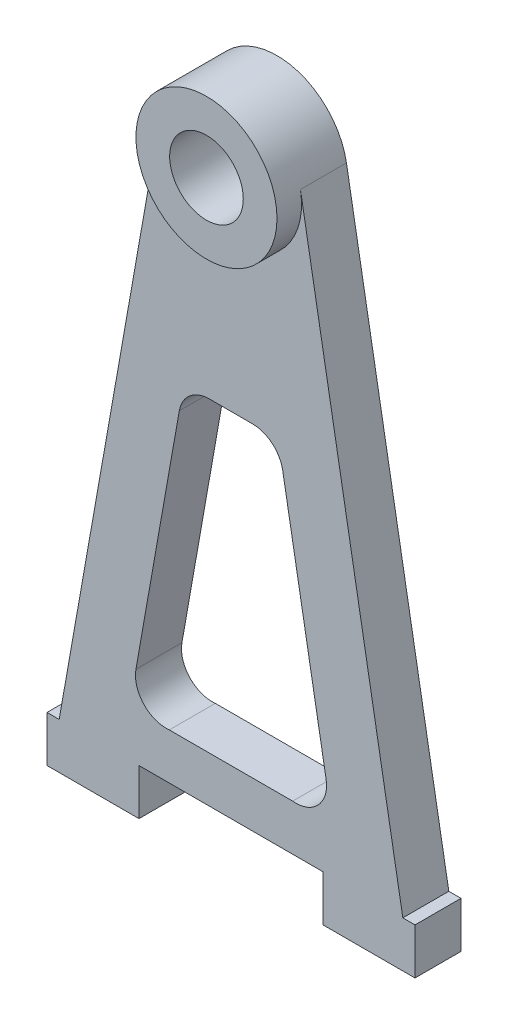
ISO-10303-21;
HEADER;
FILE_DESCRIPTION(('STEP AP214'),'2;1');
FILE_NAME('part.step','',(''),(''),'','','');
FILE_SCHEMA(('AUTOMOTIVE_DESIGN { 1 0 10303 214 1 1 1 1 }'));
ENDSEC;
DATA;
#1=APPLICATION_CONTEXT('core data for automotive mechanical design processes');
#2=APPLICATION_PROTOCOL_DEFINITION('international standard','automotive_design',2000,#1);
#3=PRODUCT_CONTEXT('',#1,'mechanical');
#4=PRODUCT('Part','Part','',(#3));
#5=PRODUCT_RELATED_PRODUCT_CATEGORY('part','',(#4));
#6=PRODUCT_DEFINITION_FORMATION('','',#4);
#7=PRODUCT_DEFINITION_CONTEXT('part definition',#1,'design');
#8=PRODUCT_DEFINITION('design','',#6,#7);
#9=PRODUCT_DEFINITION_SHAPE('','',#8);
#10=(LENGTH_UNIT() NAMED_UNIT(*) SI_UNIT(.MILLI.,.METRE.));
#11=(NAMED_UNIT(*) PLANE_ANGLE_UNIT() SI_UNIT($,.RADIAN.));
#12=(NAMED_UNIT(*) SI_UNIT($,.STERADIAN.) SOLID_ANGLE_UNIT());
#13=UNCERTAINTY_MEASURE_WITH_UNIT(LENGTH_MEASURE(1.E-05),#10,'distance_accuracy_value','');
#14=(GEOMETRIC_REPRESENTATION_CONTEXT(3) GLOBAL_UNCERTAINTY_ASSIGNED_CONTEXT((#13)) GLOBAL_UNIT_ASSIGNED_CONTEXT((#10,
#11,#12)) REPRESENTATION_CONTEXT('',''));
#15=CARTESIAN_POINT('',(0.,0.,0.));
#16=DIRECTION('',(0.,0.,1.));
#17=DIRECTION('',(1.,0.,0.));
#18=AXIS2_PLACEMENT_3D('',#15,#16,#17);
#19=CARTESIAN_POINT('',(3.63595201882336,12.0582597750053,7.5));
#20=DIRECTION('',(0.,0.,1.));
#21=DIRECTION('',(1.,0.,0.));
#22=AXIS2_PLACEMENT_3D('',#19,#20,#21);
#23=PLANE('',#22);
#24=DIRECTION('',(-0.173913043478261,0.984761013296185,0.));
#25=VECTOR('',#24,1.);
#26=CARTESIAN_POINT('',(19.1387779442577,-67.0995669868842,7.5));
#27=LINE('',#26,#25);
#28=CARTESIAN_POINT('',(19.1387779442577,-67.0995669868842,7.5));
#29=VERTEX_POINT('',#28);
#30=CARTESIAN_POINT('',(12.0697678315266,-27.0721750076034,7.5));
#31=VERTEX_POINT('',#30);
#32=EDGE_CURVE('E230',#29,#31,#27,.T.);
#33=ORIENTED_EDGE('',*,*,#32,.F.);
#34=CARTESIAN_POINT('',(14.2149728777768,-67.9691322042755,7.5));
#35=DIRECTION('',(0.,0.,1.));
#36=DIRECTION('',(1.,0.,0.));
#37=AXIS2_PLACEMENT_3D('',#34,#35,#36);
#38=CIRCLE('',#37,5.);
#39=CARTESIAN_POINT('',(13.6923167075471,-72.9417402249947,7.5));
#40=VERTEX_POINT('',#39);
#41=EDGE_CURVE('E227',#40,#29,#38,.T.);
#42=ORIENTED_EDGE('',*,*,#41,.F.);
#43=DIRECTION('',(1.,0.,0.));
#44=VECTOR('',#43,1.);
#45=CARTESIAN_POINT('',(-6.42041266990043,-72.9417402249947,7.5));
#46=LINE('',#45,#44);
#47=CARTESIAN_POINT('',(-6.42041266990043,-72.9417402249947,7.5));
#48=VERTEX_POINT('',#47);
#49=EDGE_CURVE('E249',#48,#40,#46,.T.);
#50=ORIENTED_EDGE('',*,*,#49,.F.);
#51=CARTESIAN_POINT('',(-6.9430688401301,-67.9691322042755,7.5));
#52=DIRECTION('',(0.,0.,1.));
#53=DIRECTION('',(1.,0.,0.));
#54=AXIS2_PLACEMENT_3D('',#51,#52,#53);
#55=CIRCLE('',#54,5.);
#56=CARTESIAN_POINT('',(-11.866873906611,-67.0995669868842,7.5));
#57=VERTEX_POINT('',#56);
#58=EDGE_CURVE('E246',#57,#48,#55,.T.);
#59=ORIENTED_EDGE('',*,*,#58,.F.);
#60=DIRECTION('',(-0.173913043478261,-0.984761013296185,0.));
#61=VECTOR('',#60,1.);
#62=CARTESIAN_POINT('',(-4.79786379387993,-27.0721750076034,7.5));
#63=LINE('',#62,#61);
#64=CARTESIAN_POINT('',(-4.79786379387993,-27.0721750076034,7.5));
#65=VERTEX_POINT('',#64);
#66=EDGE_CURVE('E243',#65,#57,#63,.T.);
#67=ORIENTED_EDGE('',*,*,#66,.F.);
#68=CARTESIAN_POINT('',(0.125941272600995,-27.9417402249947,7.5));
#69=DIRECTION('',(0.,0.,1.));
#70=DIRECTION('',(-1.,0.,0.));
#71=AXIS2_PLACEMENT_3D('',#68,#69,#70);
#72=CIRCLE('',#71,5.);
#73=CARTESIAN_POINT('',(0.125941272600994,-22.9417402249947,7.5));
#74=VERTEX_POINT('',#73);
#75=EDGE_CURVE('E240',#74,#65,#72,.T.);
#76=ORIENTED_EDGE('',*,*,#75,.F.);
#77=DIRECTION('',(-1.,0.,0.));
#78=VECTOR('',#77,1.);
#79=CARTESIAN_POINT('',(7.14596276504572,-22.9417402249947,7.5));
#80=LINE('',#79,#78);
#81=CARTESIAN_POINT('',(7.14596276504572,-22.9417402249947,7.5));
#82=VERTEX_POINT('',#81);
#83=EDGE_CURVE('E237',#82,#74,#80,.T.);
#84=ORIENTED_EDGE('',*,*,#83,.F.);
#85=CARTESIAN_POINT('',(7.14596276504572,-27.9417402249947,7.5));
#86=DIRECTION('',(0.,0.,1.));
#87=DIRECTION('',(1.,0.,0.));
#88=AXIS2_PLACEMENT_3D('',#85,#86,#87);
#89=CIRCLE('',#88,5.);
#90=EDGE_CURVE('E234',#31,#82,#89,.T.);
#91=ORIENTED_EDGE('',*,*,#90,.F.);
#92=EDGE_LOOP('',(#33,#42,#50,#59,#67,#76,#84,#91));
#93=FACE_BOUND('',#92,.T.);
#94=DIRECTION('',(1.,0.,0.));
#95=VECTOR('',#94,1.);
#96=CARTESIAN_POINT('',(-26.3640479811766,-87.9417402249947,7.5));
#97=LINE('',#96,#95);
#98=CARTESIAN_POINT('',(-26.3640479811766,-87.9417402249947,7.5));
#99=VERTEX_POINT('',#98);
#100=CARTESIAN_POINT('',(-11.3640479811766,-87.9417402249947,7.5));
#101=VERTEX_POINT('',#100);
#102=EDGE_CURVE('E200',#99,#101,#97,.T.);
#103=ORIENTED_EDGE('',*,*,#102,.T.);
#104=DIRECTION('',(0.,1.,0.));
#105=VECTOR('',#104,1.);
#106=CARTESIAN_POINT('',(-11.3640479811766,-87.9417402249947,7.5));
#107=LINE('',#106,#105);
#108=CARTESIAN_POINT('',(-11.3640479811766,-80.4417402249947,7.5));
#109=VERTEX_POINT('',#108);
#110=EDGE_CURVE('E180',#101,#109,#107,.T.);
#111=ORIENTED_EDGE('',*,*,#110,.T.);
#112=DIRECTION('',(1.,0.,0.));
#113=VECTOR('',#112,1.);
#114=CARTESIAN_POINT('',(-11.3640479811766,-80.4417402249947,7.5));
#115=LINE('',#114,#113);
#116=CARTESIAN_POINT('',(18.6359520188234,-80.4417402249947,7.5));
#117=VERTEX_POINT('',#116);
#118=EDGE_CURVE('E190',#109,#117,#115,.T.);
#119=ORIENTED_EDGE('',*,*,#118,.T.);
#120=DIRECTION('',(0.,1.,0.));
#121=VECTOR('',#120,1.);
#122=CARTESIAN_POINT('',(18.6359520188234,-87.9417402249947,7.5));
#123=LINE('',#122,#121);
#124=CARTESIAN_POINT('',(18.6359520188234,-87.9417402249947,7.5));
#125=VERTEX_POINT('',#124);
#126=EDGE_CURVE('E196',#125,#117,#123,.T.);
#127=ORIENTED_EDGE('',*,*,#126,.F.);
#128=CARTESIAN_POINT('',(33.6359520188234,-87.9417402249947,7.5));
#129=VERTEX_POINT('',#128);
#130=EDGE_CURVE('E322',#125,#129,#97,.T.);
#131=ORIENTED_EDGE('',*,*,#130,.T.);
#132=DIRECTION('',(0.,1.,0.));
#133=VECTOR('',#132,1.);
#134=CARTESIAN_POINT('',(33.6359520188234,-80.4417402249947,7.5));
#135=LINE('',#134,#133);
#136=CARTESIAN_POINT('',(33.6359520188234,-80.4417402249947,7.5));
#137=VERTEX_POINT('',#136);
#138=EDGE_CURVE('E325',#129,#137,#135,.T.);
#139=ORIENTED_EDGE('',*,*,#138,.T.);
#140=DIRECTION('',(-1.,0.,0.));
#141=VECTOR('',#140,1.);
#142=CARTESIAN_POINT('',(31.649811370749,-80.4417402249947,7.5));
#143=LINE('',#142,#141);
#144=CARTESIAN_POINT('',(31.649811370749,-80.4417402249947,7.5));
#145=VERTEX_POINT('',#144);
#146=EDGE_CURVE('E328',#137,#145,#143,.T.);
#147=ORIENTED_EDGE('',*,*,#146,.T.);
#148=DIRECTION('',(-0.173913043478261,0.984761013296185,0.));
#149=VECTOR('',#148,1.);
#150=CARTESIAN_POINT('',(14.9607036717295,14.0582597750053,7.5));
#151=LINE('',#150,#149);
#152=CARTESIAN_POINT('',(14.9607036717295,14.0582597750053,7.5));
#153=VERTEX_POINT('',#152);
#154=EDGE_CURVE('E331',#145,#153,#151,.T.);
#155=ORIENTED_EDGE('',*,*,#154,.T.);
#156=CARTESIAN_POINT('',(3.63595201882336,12.0582597750053,7.5));
#157=DIRECTION('',(0.,0.,1.));
#158=DIRECTION('',(1.,0.,0.));
#159=AXIS2_PLACEMENT_3D('',#156,#157,#158);
#160=CIRCLE('',#159,11.5);
#161=CARTESIAN_POINT('',(-7.68879963408277,14.0582597750053,7.5));
#162=VERTEX_POINT('',#161);
#163=EDGE_CURVE('E221',#162,#153,#160,.T.);
#164=ORIENTED_EDGE('',*,*,#163,.F.);
#165=DIRECTION('',(-0.173913043478261,-0.984761013296185,0.));
#166=VECTOR('',#165,1.);
#167=CARTESIAN_POINT('',(-7.68879963408277,14.0582597750053,7.5));
#168=LINE('',#167,#166);
#169=CARTESIAN_POINT('',(-24.3779073331023,-80.4417402249947,7.5));
#170=VERTEX_POINT('',#169);
#171=EDGE_CURVE('E312',#162,#170,#168,.T.);
#172=ORIENTED_EDGE('',*,*,#171,.T.);
#173=DIRECTION('',(-1.,0.,0.));
#174=VECTOR('',#173,1.);
#175=CARTESIAN_POINT('',(-26.3640479811766,-80.4417402249947,7.5));
#176=LINE('',#175,#174);
#177=CARTESIAN_POINT('',(-26.3640479811766,-80.4417402249947,7.5));
#178=VERTEX_POINT('',#177);
#179=EDGE_CURVE('E315',#170,#178,#176,.T.);
#180=ORIENTED_EDGE('',*,*,#179,.T.);
#181=DIRECTION('',(0.,-1.,0.));
#182=VECTOR('',#181,1.);
#183=CARTESIAN_POINT('',(-26.3640479811766,-87.9417402249947,7.5));
#184=LINE('',#183,#182);
#185=EDGE_CURVE('E319',#178,#99,#184,.T.);
#186=ORIENTED_EDGE('',*,*,#185,.T.);
#187=EDGE_LOOP('',(#103,#111,#119,#127,#131,#139,#147,#155,#164,#172,#180,#186));
#188=FACE_BOUND('',#187,.T.);
#189=ADVANCED_FACE('F39',(#93,#188),#23,.T.);
#190=CARTESIAN_POINT('',(3.63595201882336,12.0582597750053,0.));
#191=DIRECTION('',(0.,0.,1.));
#192=DIRECTION('',(1.,0.,0.));
#193=AXIS2_PLACEMENT_3D('',#190,#191,#192);
#194=PLANE('',#193);
#195=CARTESIAN_POINT('',(14.2149728777768,-67.9691322042755,0.));
#196=DIRECTION('',(0.,0.,1.));
#197=DIRECTION('',(1.,0.,0.));
#198=AXIS2_PLACEMENT_3D('',#195,#196,#197);
#199=CIRCLE('',#198,5.);
#200=CARTESIAN_POINT('',(13.6923167075471,-72.9417402249947,0.));
#201=VERTEX_POINT('',#200);
#202=CARTESIAN_POINT('',(19.1387779442577,-67.0995669868842,0.));
#203=VERTEX_POINT('',#202);
#204=EDGE_CURVE('E220',#201,#203,#199,.T.);
#205=ORIENTED_EDGE('',*,*,#204,.T.);
#206=DIRECTION('',(-0.173913043478261,0.984761013296185,0.));
#207=VECTOR('',#206,1.);
#208=CARTESIAN_POINT('',(19.1387779442577,-67.0995669868842,0.));
#209=LINE('',#208,#207);
#210=CARTESIAN_POINT('',(12.0697678315266,-27.0721750076034,0.));
#211=VERTEX_POINT('',#210);
#212=EDGE_CURVE('E256',#203,#211,#209,.T.);
#213=ORIENTED_EDGE('',*,*,#212,.T.);
#214=CARTESIAN_POINT('',(7.14596276504572,-27.9417402249947,0.));
#215=DIRECTION('',(0.,0.,1.));
#216=DIRECTION('',(1.,0.,0.));
#217=AXIS2_PLACEMENT_3D('',#214,#215,#216);
#218=CIRCLE('',#217,5.);
#219=CARTESIAN_POINT('',(7.14596276504572,-22.9417402249947,0.));
#220=VERTEX_POINT('',#219);
#221=EDGE_CURVE('E260',#211,#220,#218,.T.);
#222=ORIENTED_EDGE('',*,*,#221,.T.);
#223=DIRECTION('',(-1.,0.,0.));
#224=VECTOR('',#223,1.);
#225=CARTESIAN_POINT('',(7.14596276504572,-22.9417402249947,0.));
#226=LINE('',#225,#224);
#227=CARTESIAN_POINT('',(0.125941272600994,-22.9417402249947,0.));
#228=VERTEX_POINT('',#227);
#229=EDGE_CURVE('E264',#220,#228,#226,.T.);
#230=ORIENTED_EDGE('',*,*,#229,.T.);
#231=CARTESIAN_POINT('',(0.125941272600995,-27.9417402249947,0.));
#232=DIRECTION('',(0.,0.,1.));
#233=DIRECTION('',(-1.,0.,0.));
#234=AXIS2_PLACEMENT_3D('',#231,#232,#233);
#235=CIRCLE('',#234,5.);
#236=CARTESIAN_POINT('',(-4.79786379387993,-27.0721750076034,0.));
#237=VERTEX_POINT('',#236);
#238=EDGE_CURVE('E268',#228,#237,#235,.T.);
#239=ORIENTED_EDGE('',*,*,#238,.T.);
#240=DIRECTION('',(-0.173913043478261,-0.984761013296185,0.));
#241=VECTOR('',#240,1.);
#242=CARTESIAN_POINT('',(-4.79786379387993,-27.0721750076034,0.));
#243=LINE('',#242,#241);
#244=CARTESIAN_POINT('',(-11.866873906611,-67.0995669868842,0.));
#245=VERTEX_POINT('',#244);
#246=EDGE_CURVE('E272',#237,#245,#243,.T.);
#247=ORIENTED_EDGE('',*,*,#246,.T.);
#248=CARTESIAN_POINT('',(-6.9430688401301,-67.9691322042755,0.));
#249=DIRECTION('',(0.,0.,1.));
#250=DIRECTION('',(1.,0.,0.));
#251=AXIS2_PLACEMENT_3D('',#248,#249,#250);
#252=CIRCLE('',#251,5.);
#253=CARTESIAN_POINT('',(-6.42041266990043,-72.9417402249947,0.));
#254=VERTEX_POINT('',#253);
#255=EDGE_CURVE('E276',#245,#254,#252,.T.);
#256=ORIENTED_EDGE('',*,*,#255,.T.);
#257=DIRECTION('',(1.,0.,0.));
#258=VECTOR('',#257,1.);
#259=CARTESIAN_POINT('',(-6.42041266990043,-72.9417402249947,0.));
#260=LINE('',#259,#258);
#261=EDGE_CURVE('E231',#254,#201,#260,.T.);
#262=ORIENTED_EDGE('',*,*,#261,.T.);
#263=EDGE_LOOP('',(#205,#213,#222,#230,#239,#247,#256,#262));
#264=FACE_BOUND('',#263,.T.);
#265=CARTESIAN_POINT('',(3.63595201882336,12.0582597750053,0.));
#266=DIRECTION('',(0.,0.,1.));
#267=DIRECTION('',(1.,0.,0.));
#268=AXIS2_PLACEMENT_3D('',#265,#266,#267);
#269=CIRCLE('',#268,6.);
#270=CARTESIAN_POINT('',(9.63595201882335,12.0582597750053,0.));
#271=VERTEX_POINT('',#270);
#272=EDGE_CURVE('E307',#271,#271,#269,.T.);
#273=ORIENTED_EDGE('',*,*,#272,.T.);
#274=EDGE_LOOP('',(#273));
#275=FACE_BOUND('',#274,.T.);
#276=DIRECTION('',(0.,1.,0.));
#277=VECTOR('',#276,1.);
#278=CARTESIAN_POINT('',(-11.3640479811766,12.0582597750053,0.));
#279=LINE('',#278,#277);
#280=CARTESIAN_POINT('',(-11.3640479811766,-87.9417402249947,0.));
#281=VERTEX_POINT('',#280);
#282=CARTESIAN_POINT('',(-11.3640479811766,-80.4417402249947,0.));
#283=VERTEX_POINT('',#282);
#284=EDGE_CURVE('E183',#281,#283,#279,.T.);
#285=ORIENTED_EDGE('',*,*,#284,.F.);
#286=DIRECTION('',(1.,0.,0.));
#287=VECTOR('',#286,1.);
#288=CARTESIAN_POINT('',(-26.3640479811766,-87.9417402249947,0.));
#289=LINE('',#288,#287);
#290=CARTESIAN_POINT('',(-26.3640479811766,-87.9417402249947,0.));
#291=VERTEX_POINT('',#290);
#292=EDGE_CURVE('E349',#291,#281,#289,.T.);
#293=ORIENTED_EDGE('',*,*,#292,.F.);
#294=DIRECTION('',(0.,-1.,0.));
#295=VECTOR('',#294,1.);
#296=CARTESIAN_POINT('',(-26.3640479811766,-87.9417402249947,0.));
#297=LINE('',#296,#295);
#298=CARTESIAN_POINT('',(-26.3640479811766,-80.4417402249947,0.));
#299=VERTEX_POINT('',#298);
#300=EDGE_CURVE('E345',#299,#291,#297,.T.);
#301=ORIENTED_EDGE('',*,*,#300,.F.);
#302=DIRECTION('',(-1.,0.,0.));
#303=VECTOR('',#302,1.);
#304=CARTESIAN_POINT('',(-26.3640479811766,-80.4417402249947,0.));
#305=LINE('',#304,#303);
#306=CARTESIAN_POINT('',(-24.3779073331023,-80.4417402249947,0.));
#307=VERTEX_POINT('',#306);
#308=EDGE_CURVE('E342',#307,#299,#305,.T.);
#309=ORIENTED_EDGE('',*,*,#308,.F.);
#310=DIRECTION('',(-0.173913043478261,-0.984761013296185,0.));
#311=VECTOR('',#310,1.);
#312=CARTESIAN_POINT('',(-7.68879963408277,14.0582597750053,0.));
#313=LINE('',#312,#311);
#314=CARTESIAN_POINT('',(-7.68879963408277,14.0582597750053,0.));
#315=VERTEX_POINT('',#314);
#316=EDGE_CURVE('E339',#315,#307,#313,.T.);
#317=ORIENTED_EDGE('',*,*,#316,.F.);
#318=CARTESIAN_POINT('',(3.63595201882336,12.0582597750053,0.));
#319=DIRECTION('',(0.,0.,1.));
#320=DIRECTION('',(1.,0.,0.));
#321=AXIS2_PLACEMENT_3D('',#318,#319,#320);
#322=CIRCLE('',#321,11.5);
#323=CARTESIAN_POINT('',(14.9607036717295,14.0582597750053,0.));
#324=VERTEX_POINT('',#323);
#325=EDGE_CURVE('E311',#324,#315,#322,.T.);
#326=ORIENTED_EDGE('',*,*,#325,.F.);
#327=DIRECTION('',(-0.173913043478261,0.984761013296185,0.));
#328=VECTOR('',#327,1.);
#329=CARTESIAN_POINT('',(14.9607036717295,14.0582597750053,0.));
#330=LINE('',#329,#328);
#331=CARTESIAN_POINT('',(31.649811370749,-80.4417402249947,0.));
#332=VERTEX_POINT('',#331);
#333=EDGE_CURVE('E316',#332,#324,#330,.T.);
#334=ORIENTED_EDGE('',*,*,#333,.F.);
#335=DIRECTION('',(-1.,0.,0.));
#336=VECTOR('',#335,1.);
#337=CARTESIAN_POINT('',(31.649811370749,-80.4417402249947,0.));
#338=LINE('',#337,#336);
#339=CARTESIAN_POINT('',(33.6359520188234,-80.4417402249947,0.));
#340=VERTEX_POINT('',#339);
#341=EDGE_CURVE('E356',#340,#332,#338,.T.);
#342=ORIENTED_EDGE('',*,*,#341,.F.);
#343=DIRECTION('',(0.,1.,0.));
#344=VECTOR('',#343,1.);
#345=CARTESIAN_POINT('',(33.6359520188234,-80.4417402249947,0.));
#346=LINE('',#345,#344);
#347=CARTESIAN_POINT('',(33.6359520188234,-87.9417402249947,0.));
#348=VERTEX_POINT('',#347);
#349=EDGE_CURVE('E353',#348,#340,#346,.T.);
#350=ORIENTED_EDGE('',*,*,#349,.F.);
#351=CARTESIAN_POINT('',(18.6359520188234,-87.9417402249947,0.));
#352=VERTEX_POINT('',#351);
#353=EDGE_CURVE('E348',#352,#348,#289,.T.);
#354=ORIENTED_EDGE('',*,*,#353,.F.);
#355=DIRECTION('',(0.,1.,0.));
#356=VECTOR('',#355,1.);
#357=CARTESIAN_POINT('',(18.6359520188234,12.0582597750053,0.));
#358=LINE('',#357,#356);
#359=CARTESIAN_POINT('',(18.6359520188234,-80.4417402249947,0.));
#360=VERTEX_POINT('',#359);
#361=EDGE_CURVE('E55',#352,#360,#358,.T.);
#362=ORIENTED_EDGE('',*,*,#361,.T.);
#363=DIRECTION('',(1.,0.,0.));
#364=VECTOR('',#363,1.);
#365=CARTESIAN_POINT('',(3.63595201882336,-80.4417402249947,0.));
#366=LINE('',#365,#364);
#367=EDGE_CURVE('E11',#283,#360,#366,.T.);
#368=ORIENTED_EDGE('',*,*,#367,.F.);
#369=EDGE_LOOP('',(#285,#293,#301,#309,#317,#326,#334,#342,#350,#354,#362,#368));
#370=FACE_BOUND('',#369,.T.);
#371=ADVANCED_FACE('F396',(#264,#275,#370),#194,.F.);
#372=CARTESIAN_POINT('',(-26.3640479811766,-87.9417402249947,7.5));
#373=DIRECTION('',(0.,1.,0.));
#374=DIRECTION('',(-1.,0.,0.));
#375=AXIS2_PLACEMENT_3D('',#372,#373,#374);
#376=PLANE('',#375);
#377=DIRECTION('',(0.,0.,-1.));
#378=VECTOR('',#377,1.);
#379=CARTESIAN_POINT('',(-11.3640479811766,-87.9417402249947,7.5));
#380=LINE('',#379,#378);
#381=EDGE_CURVE('E48',#101,#281,#380,.T.);
#382=ORIENTED_EDGE('',*,*,#381,.F.);
#383=ORIENTED_EDGE('',*,*,#102,.F.);
#384=DIRECTION('',(0.,0.,-1.));
#385=VECTOR('',#384,1.);
#386=CARTESIAN_POINT('',(-26.3640479811766,-87.9417402249947,7.5));
#387=LINE('',#386,#385);
#388=EDGE_CURVE('E376',#99,#291,#387,.T.);
#389=ORIENTED_EDGE('',*,*,#388,.T.);
#390=ORIENTED_EDGE('',*,*,#292,.T.);
#391=EDGE_LOOP('',(#382,#383,#389,#390));
#392=FACE_BOUND('',#391,.T.);
#393=ADVANCED_FACE('F398',(#392),#376,.F.);
#394=CARTESIAN_POINT('',(3.63595201882336,12.0582597750053,7.5));
#395=DIRECTION('',(0.,0.,-1.));
#396=DIRECTION('',(-1.,0.,0.));
#397=AXIS2_PLACEMENT_3D('',#394,#395,#396);
#398=CYLINDRICAL_SURFACE('',#397,11.5);
#399=ORIENTED_EDGE('',*,*,#325,.T.);
#400=DIRECTION('',(0.,0.,-1.));
#401=VECTOR('',#400,1.);
#402=CARTESIAN_POINT('',(-7.68879963408277,14.0582597750053,7.5));
#403=LINE('',#402,#401);
#404=EDGE_CURVE('E226',#162,#315,#403,.T.);
#405=ORIENTED_EDGE('',*,*,#404,.F.);
#406=ORIENTED_EDGE('',*,*,#163,.T.);
#407=DIRECTION('',(0.,0.,-1.));
#408=VECTOR('',#407,1.);
#409=CARTESIAN_POINT('',(14.9607036717295,14.0582597750053,7.5));
#410=LINE('',#409,#408);
#411=EDGE_CURVE('E335',#153,#324,#410,.T.);
#412=ORIENTED_EDGE('',*,*,#411,.T.);
#413=EDGE_LOOP('',(#399,#405,#406,#412));
#414=FACE_BOUND('',#413,.T.);
#415=CARTESIAN_POINT('',(3.63595201882336,12.0582597750053,11.5));
#416=DIRECTION('',(0.,0.,1.));
#417=DIRECTION('',(1.,0.,0.));
#418=AXIS2_PLACEMENT_3D('',#415,#416,#417);
#419=CIRCLE('',#418,11.5);
#420=CARTESIAN_POINT('',(15.1359520188234,12.0582597750053,11.5));
#421=VERTEX_POINT('',#420);
#422=EDGE_CURVE('E216',#421,#421,#419,.T.);
#423=ORIENTED_EDGE('',*,*,#422,.F.);
#424=EDGE_LOOP('',(#423));
#425=FACE_BOUND('',#424,.T.);
#426=ADVANCED_FACE('F41',(#414,#425),#398,.T.);
#427=CARTESIAN_POINT('',(-7.68879963408277,14.0582597750053,7.5));
#428=DIRECTION('',(0.984761013296185,-0.173913043478261,0.));
#429=DIRECTION('',(0.173913043478261,0.984761013296185,0.));
#430=AXIS2_PLACEMENT_3D('',#427,#428,#429);
#431=PLANE('',#430);
#432=ORIENTED_EDGE('',*,*,#316,.T.);
#433=DIRECTION('',(0.,0.,-1.));
#434=VECTOR('',#433,1.);
#435=CARTESIAN_POINT('',(-24.3779073331023,-80.4417402249947,7.5));
#436=LINE('',#435,#434);
#437=EDGE_CURVE('E384',#170,#307,#436,.T.);
#438=ORIENTED_EDGE('',*,*,#437,.F.);
#439=ORIENTED_EDGE('',*,*,#171,.F.);
#440=ORIENTED_EDGE('',*,*,#404,.T.);
#441=EDGE_LOOP('',(#432,#438,#439,#440));
#442=FACE_BOUND('',#441,.T.);
#443=ADVANCED_FACE('F412',(#442),#431,.F.);
#444=CARTESIAN_POINT('',(-26.3640479811766,-80.4417402249947,7.5));
#445=DIRECTION('',(0.,-1.,0.));
#446=DIRECTION('',(1.,0.,0.));
#447=AXIS2_PLACEMENT_3D('',#444,#445,#446);
#448=PLANE('',#447);
#449=ORIENTED_EDGE('',*,*,#308,.T.);
#450=DIRECTION('',(0.,0.,-1.));
#451=VECTOR('',#450,1.);
#452=CARTESIAN_POINT('',(-26.3640479811766,-80.4417402249947,7.5));
#453=LINE('',#452,#451);
#454=EDGE_CURVE('E380',#178,#299,#453,.T.);
#455=ORIENTED_EDGE('',*,*,#454,.F.);
#456=ORIENTED_EDGE('',*,*,#179,.F.);
#457=ORIENTED_EDGE('',*,*,#437,.T.);
#458=EDGE_LOOP('',(#449,#455,#456,#457));
#459=FACE_BOUND('',#458,.T.);
#460=ADVANCED_FACE('F407',(#459),#448,.F.);
#461=CARTESIAN_POINT('',(-26.3640479811766,-87.9417402249947,7.5));
#462=DIRECTION('',(1.,0.,0.));
#463=DIRECTION('',(0.,0.,-1.));
#464=AXIS2_PLACEMENT_3D('',#461,#462,#463);
#465=PLANE('',#464);
#466=ORIENTED_EDGE('',*,*,#300,.T.);
#467=ORIENTED_EDGE('',*,*,#388,.F.);
#468=ORIENTED_EDGE('',*,*,#185,.F.);
#469=ORIENTED_EDGE('',*,*,#454,.T.);
#470=EDGE_LOOP('',(#466,#467,#468,#469));
#471=FACE_BOUND('',#470,.T.);
#472=ADVANCED_FACE('F402',(#471),#465,.F.);
#473=ORIENTED_EDGE('',*,*,#130,.F.);
#474=DIRECTION('',(0.,0.,-1.));
#475=VECTOR('',#474,1.);
#476=CARTESIAN_POINT('',(18.6359520188234,-87.9417402249947,7.5));
#477=LINE('',#476,#475);
#478=EDGE_CURVE('E225',#125,#352,#477,.T.);
#479=ORIENTED_EDGE('',*,*,#478,.T.);
#480=ORIENTED_EDGE('',*,*,#353,.T.);
#481=DIRECTION('',(0.,0.,-1.));
#482=VECTOR('',#481,1.);
#483=CARTESIAN_POINT('',(33.6359520188234,-87.9417402249947,7.5));
#484=LINE('',#483,#482);
#485=EDGE_CURVE('E372',#129,#348,#484,.T.);
#486=ORIENTED_EDGE('',*,*,#485,.F.);
#487=EDGE_LOOP('',(#473,#479,#480,#486));
#488=FACE_BOUND('',#487,.T.);
#489=ADVANCED_FACE('F436',(#488),#376,.F.);
#490=CARTESIAN_POINT('',(33.6359520188234,-80.4417402249947,7.5));
#491=DIRECTION('',(-1.,0.,0.));
#492=DIRECTION('',(0.,0.,1.));
#493=AXIS2_PLACEMENT_3D('',#490,#491,#492);
#494=PLANE('',#493);
#495=ORIENTED_EDGE('',*,*,#349,.T.);
#496=DIRECTION('',(0.,0.,-1.));
#497=VECTOR('',#496,1.);
#498=CARTESIAN_POINT('',(33.6359520188234,-80.4417402249947,7.5));
#499=LINE('',#498,#497);
#500=EDGE_CURVE('E368',#137,#340,#499,.T.);
#501=ORIENTED_EDGE('',*,*,#500,.F.);
#502=ORIENTED_EDGE('',*,*,#138,.F.);
#503=ORIENTED_EDGE('',*,*,#485,.T.);
#504=EDGE_LOOP('',(#495,#501,#502,#503));
#505=FACE_BOUND('',#504,.T.);
#506=ADVANCED_FACE('F429',(#505),#494,.F.);
#507=CARTESIAN_POINT('',(31.649811370749,-80.4417402249947,7.5));
#508=DIRECTION('',(0.,-1.,0.));
#509=DIRECTION('',(1.,0.,0.));
#510=AXIS2_PLACEMENT_3D('',#507,#508,#509);
#511=PLANE('',#510);
#512=ORIENTED_EDGE('',*,*,#341,.T.);
#513=DIRECTION('',(0.,0.,-1.));
#514=VECTOR('',#513,1.);
#515=CARTESIAN_POINT('',(31.649811370749,-80.4417402249947,7.5));
#516=LINE('',#515,#514);
#517=EDGE_CURVE('E364',#145,#332,#516,.T.);
#518=ORIENTED_EDGE('',*,*,#517,.F.);
#519=ORIENTED_EDGE('',*,*,#146,.F.);
#520=ORIENTED_EDGE('',*,*,#500,.T.);
#521=EDGE_LOOP('',(#512,#518,#519,#520));
#522=FACE_BOUND('',#521,.T.);
#523=ADVANCED_FACE('F425',(#522),#511,.F.);
#524=CARTESIAN_POINT('',(14.9607036717295,14.0582597750053,7.5));
#525=DIRECTION('',(-0.984761013296185,-0.173913043478261,0.));
#526=DIRECTION('',(0.173913043478261,-0.984761013296185,0.));
#527=AXIS2_PLACEMENT_3D('',#524,#525,#526);
#528=PLANE('',#527);
#529=ORIENTED_EDGE('',*,*,#333,.T.);
#530=ORIENTED_EDGE('',*,*,#411,.F.);
#531=ORIENTED_EDGE('',*,*,#154,.F.);
#532=ORIENTED_EDGE('',*,*,#517,.T.);
#533=EDGE_LOOP('',(#529,#530,#531,#532));
#534=FACE_BOUND('',#533,.T.);
#535=ADVANCED_FACE('F420',(#534),#528,.F.);
#536=CARTESIAN_POINT('',(3.63595201882336,12.0582597750053,7.5));
#537=DIRECTION('',(0.,0.,-1.));
#538=DIRECTION('',(-1.,0.,0.));
#539=AXIS2_PLACEMENT_3D('',#536,#537,#538);
#540=CYLINDRICAL_SURFACE('',#539,6.);
#541=ORIENTED_EDGE('',*,*,#272,.F.);
#542=EDGE_LOOP('',(#541));
#543=FACE_BOUND('',#542,.T.);
#544=CARTESIAN_POINT('',(3.63595201882336,12.0582597750053,11.5));
#545=DIRECTION('',(0.,0.,1.));
#546=DIRECTION('',(1.,0.,0.));
#547=AXIS2_PLACEMENT_3D('',#544,#545,#546);
#548=CIRCLE('',#547,6.);
#549=CARTESIAN_POINT('',(9.63595201882335,12.0582597750053,11.5));
#550=VERTEX_POINT('',#549);
#551=EDGE_CURVE('E212',#550,#550,#548,.T.);
#552=ORIENTED_EDGE('',*,*,#551,.T.);
#553=EDGE_LOOP('',(#552));
#554=FACE_BOUND('',#553,.T.);
#555=ADVANCED_FACE('F456',(#543,#554),#540,.F.);
#556=CARTESIAN_POINT('',(14.2149728777768,-67.9691322042755,7.5));
#557=DIRECTION('',(0.,0.,-1.));
#558=DIRECTION('',(-1.,0.,0.));
#559=AXIS2_PLACEMENT_3D('',#556,#557,#558);
#560=CYLINDRICAL_SURFACE('',#559,5.);
#561=ORIENTED_EDGE('',*,*,#204,.F.);
#562=DIRECTION('',(0.,0.,-1.));
#563=VECTOR('',#562,1.);
#564=CARTESIAN_POINT('',(13.6923167075471,-72.9417402249947,7.5));
#565=LINE('',#564,#563);
#566=EDGE_CURVE('E252',#40,#201,#565,.T.);
#567=ORIENTED_EDGE('',*,*,#566,.F.);
#568=ORIENTED_EDGE('',*,*,#41,.T.);
#569=DIRECTION('',(0.,0.,-1.));
#570=VECTOR('',#569,1.);
#571=CARTESIAN_POINT('',(19.1387779442577,-67.0995669868842,7.5));
#572=LINE('',#571,#570);
#573=EDGE_CURVE('E303',#29,#203,#572,.T.);
#574=ORIENTED_EDGE('',*,*,#573,.T.);
#575=EDGE_LOOP('',(#561,#567,#568,#574));
#576=FACE_BOUND('',#575,.T.);
#577=ADVANCED_FACE('F477',(#576),#560,.F.);
#578=CARTESIAN_POINT('',(19.1387779442577,-67.0995669868842,7.5));
#579=DIRECTION('',(-0.984761013296185,-0.173913043478261,0.));
#580=DIRECTION('',(0.173913043478261,-0.984761013296185,0.));
#581=AXIS2_PLACEMENT_3D('',#578,#579,#580);
#582=PLANE('',#581);
#583=ORIENTED_EDGE('',*,*,#212,.F.);
#584=ORIENTED_EDGE('',*,*,#573,.F.);
#585=ORIENTED_EDGE('',*,*,#32,.T.);
#586=DIRECTION('',(0.,0.,-1.));
#587=VECTOR('',#586,1.);
#588=CARTESIAN_POINT('',(12.0697678315266,-27.0721750076034,7.5));
#589=LINE('',#588,#587);
#590=EDGE_CURVE('E300',#31,#211,#589,.T.);
#591=ORIENTED_EDGE('',*,*,#590,.T.);
#592=EDGE_LOOP('',(#583,#584,#585,#591));
#593=FACE_BOUND('',#592,.T.);
#594=ADVANCED_FACE('F485',(#593),#582,.T.);
#595=CARTESIAN_POINT('',(7.14596276504572,-27.9417402249947,7.5));
#596=DIRECTION('',(0.,0.,-1.));
#597=DIRECTION('',(-1.,0.,0.));
#598=AXIS2_PLACEMENT_3D('',#595,#596,#597);
#599=CYLINDRICAL_SURFACE('',#598,5.);
#600=ORIENTED_EDGE('',*,*,#221,.F.);
#601=ORIENTED_EDGE('',*,*,#590,.F.);
#602=ORIENTED_EDGE('',*,*,#90,.T.);
#603=DIRECTION('',(0.,0.,-1.));
#604=VECTOR('',#603,1.);
#605=CARTESIAN_POINT('',(7.14596276504572,-22.9417402249947,7.5));
#606=LINE('',#605,#604);
#607=EDGE_CURVE('E297',#82,#220,#606,.T.);
#608=ORIENTED_EDGE('',*,*,#607,.T.);
#609=EDGE_LOOP('',(#600,#601,#602,#608));
#610=FACE_BOUND('',#609,.T.);
#611=ADVANCED_FACE('F492',(#610),#599,.F.);
#612=CARTESIAN_POINT('',(7.14596276504572,-22.9417402249947,7.5));
#613=DIRECTION('',(0.,-1.,0.));
#614=DIRECTION('',(0.,0.,-1.));
#615=AXIS2_PLACEMENT_3D('',#612,#613,#614);
#616=PLANE('',#615);
#617=ORIENTED_EDGE('',*,*,#229,.F.);
#618=ORIENTED_EDGE('',*,*,#607,.F.);
#619=ORIENTED_EDGE('',*,*,#83,.T.);
#620=DIRECTION('',(0.,0.,-1.));
#621=VECTOR('',#620,1.);
#622=CARTESIAN_POINT('',(0.125941272600994,-22.9417402249947,7.5));
#623=LINE('',#622,#621);
#624=EDGE_CURVE('E294',#74,#228,#623,.T.);
#625=ORIENTED_EDGE('',*,*,#624,.T.);
#626=EDGE_LOOP('',(#617,#618,#619,#625));
#627=FACE_BOUND('',#626,.T.);
#628=ADVANCED_FACE('F500',(#627),#616,.T.);
#629=CARTESIAN_POINT('',(0.125941272600995,-27.9417402249947,7.5));
#630=DIRECTION('',(0.,0.,-1.));
#631=DIRECTION('',(-1.,0.,0.));
#632=AXIS2_PLACEMENT_3D('',#629,#630,#631);
#633=CYLINDRICAL_SURFACE('',#632,5.);
#634=ORIENTED_EDGE('',*,*,#238,.F.);
#635=ORIENTED_EDGE('',*,*,#624,.F.);
#636=ORIENTED_EDGE('',*,*,#75,.T.);
#637=DIRECTION('',(0.,0.,-1.));
#638=VECTOR('',#637,1.);
#639=CARTESIAN_POINT('',(-4.79786379387993,-27.0721750076034,7.5));
#640=LINE('',#639,#638);
#641=EDGE_CURVE('E291',#65,#237,#640,.T.);
#642=ORIENTED_EDGE('',*,*,#641,.T.);
#643=EDGE_LOOP('',(#634,#635,#636,#642));
#644=FACE_BOUND('',#643,.T.);
#645=ADVANCED_FACE('F508',(#644),#633,.F.);
#646=CARTESIAN_POINT('',(-4.79786379387993,-27.0721750076034,7.5));
#647=DIRECTION('',(0.984761013296185,-0.173913043478261,0.));
#648=DIRECTION('',(0.173913043478261,0.984761013296185,0.));
#649=AXIS2_PLACEMENT_3D('',#646,#647,#648);
#650=PLANE('',#649);
#651=ORIENTED_EDGE('',*,*,#246,.F.);
#652=ORIENTED_EDGE('',*,*,#641,.F.);
#653=ORIENTED_EDGE('',*,*,#66,.T.);
#654=DIRECTION('',(0.,0.,-1.));
#655=VECTOR('',#654,1.);
#656=CARTESIAN_POINT('',(-11.866873906611,-67.0995669868842,7.5));
#657=LINE('',#656,#655);
#658=EDGE_CURVE('E288',#57,#245,#657,.T.);
#659=ORIENTED_EDGE('',*,*,#658,.T.);
#660=EDGE_LOOP('',(#651,#652,#653,#659));
#661=FACE_BOUND('',#660,.T.);
#662=ADVANCED_FACE('F516',(#661),#650,.T.);
#663=CARTESIAN_POINT('',(-6.9430688401301,-67.9691322042755,7.5));
#664=DIRECTION('',(0.,0.,-1.));
#665=DIRECTION('',(-1.,0.,0.));
#666=AXIS2_PLACEMENT_3D('',#663,#664,#665);
#667=CYLINDRICAL_SURFACE('',#666,5.);
#668=ORIENTED_EDGE('',*,*,#255,.F.);
#669=ORIENTED_EDGE('',*,*,#658,.F.);
#670=ORIENTED_EDGE('',*,*,#58,.T.);
#671=DIRECTION('',(0.,0.,-1.));
#672=VECTOR('',#671,1.);
#673=CARTESIAN_POINT('',(-6.42041266990043,-72.9417402249947,7.5));
#674=LINE('',#673,#672);
#675=EDGE_CURVE('E63',#48,#254,#674,.T.);
#676=ORIENTED_EDGE('',*,*,#675,.T.);
#677=EDGE_LOOP('',(#668,#669,#670,#676));
#678=FACE_BOUND('',#677,.T.);
#679=ADVANCED_FACE('F524',(#678),#667,.F.);
#680=CARTESIAN_POINT('',(-6.42041266990043,-72.9417402249947,7.5));
#681=DIRECTION('',(0.,1.,0.));
#682=DIRECTION('',(0.,0.,1.));
#683=AXIS2_PLACEMENT_3D('',#680,#681,#682);
#684=PLANE('',#683);
#685=ORIENTED_EDGE('',*,*,#261,.F.);
#686=ORIENTED_EDGE('',*,*,#675,.F.);
#687=ORIENTED_EDGE('',*,*,#49,.T.);
#688=ORIENTED_EDGE('',*,*,#566,.T.);
#689=EDGE_LOOP('',(#685,#686,#687,#688));
#690=FACE_BOUND('',#689,.T.);
#691=ADVANCED_FACE('F532',(#690),#684,.T.);
#692=CARTESIAN_POINT('',(3.63595201882336,12.0582597750053,11.5));
#693=DIRECTION('',(0.,0.,1.));
#694=DIRECTION('',(1.,0.,0.));
#695=AXIS2_PLACEMENT_3D('',#692,#693,#694);
#696=PLANE('',#695);
#697=ORIENTED_EDGE('',*,*,#422,.T.);
#698=EDGE_LOOP('',(#697));
#699=FACE_BOUND('',#698,.T.);
#700=ORIENTED_EDGE('',*,*,#551,.F.);
#701=EDGE_LOOP('',(#700));
#702=FACE_BOUND('',#701,.T.);
#703=ADVANCED_FACE('F540',(#699,#702),#696,.T.);
#704=CARTESIAN_POINT('',(-11.3640479811766,-80.4417402249947,-9.5));
#705=DIRECTION('',(0.,-1.,0.));
#706=DIRECTION('',(0.,0.,-1.));
#707=AXIS2_PLACEMENT_3D('',#704,#705,#706);
#708=PLANE('',#707);
#709=ORIENTED_EDGE('',*,*,#367,.T.);
#710=DIRECTION('',(0.,0.,1.));
#711=VECTOR('',#710,1.);
#712=CARTESIAN_POINT('',(18.6359520188234,-80.4417402249947,-9.5));
#713=LINE('',#712,#711);
#714=EDGE_CURVE('E187',#360,#117,#713,.T.);
#715=ORIENTED_EDGE('',*,*,#714,.T.);
#716=ORIENTED_EDGE('',*,*,#118,.F.);
#717=DIRECTION('',(0.,0.,1.));
#718=VECTOR('',#717,1.);
#719=CARTESIAN_POINT('',(-11.3640479811766,-80.4417402249947,-9.5));
#720=LINE('',#719,#718);
#721=EDGE_CURVE('E176',#283,#109,#720,.T.);
#722=ORIENTED_EDGE('',*,*,#721,.F.);
#723=EDGE_LOOP('',(#709,#715,#716,#722));
#724=FACE_BOUND('',#723,.T.);
#725=ADVANCED_FACE('F191',(#724),#708,.T.);
#726=CARTESIAN_POINT('',(-11.3640479811766,-87.9417402249947,-9.5));
#727=DIRECTION('',(1.,0.,0.));
#728=DIRECTION('',(0.,0.,-1.));
#729=AXIS2_PLACEMENT_3D('',#726,#727,#728);
#730=PLANE('',#729);
#731=ORIENTED_EDGE('',*,*,#284,.T.);
#732=ORIENTED_EDGE('',*,*,#721,.T.);
#733=ORIENTED_EDGE('',*,*,#110,.F.);
#734=ORIENTED_EDGE('',*,*,#381,.T.);
#735=EDGE_LOOP('',(#731,#732,#733,#734));
#736=FACE_BOUND('',#735,.T.);
#737=ADVANCED_FACE('F178',(#736),#730,.T.);
#738=CARTESIAN_POINT('',(18.6359520188234,-87.9417402249947,-9.5));
#739=DIRECTION('',(1.,0.,0.));
#740=DIRECTION('',(0.,0.,-1.));
#741=AXIS2_PLACEMENT_3D('',#738,#739,#740);
#742=PLANE('',#741);
#743=ORIENTED_EDGE('',*,*,#478,.F.);
#744=ORIENTED_EDGE('',*,*,#126,.T.);
#745=ORIENTED_EDGE('',*,*,#714,.F.);
#746=ORIENTED_EDGE('',*,*,#361,.F.);
#747=EDGE_LOOP('',(#743,#744,#745,#746));
#748=FACE_BOUND('',#747,.T.);
#749=ADVANCED_FACE('F560',(#748),#742,.F.);
#750=CLOSED_SHELL('',(#189,#371,#393,#426,#443,#460,#472,#489,#506,#523,#535,#555,#577,#594,
#611,#628,#645,#662,#679,#691,#703,#725,#737,#749));
#751=MANIFOLD_SOLID_BREP('B2',#750);
#752=ADVANCED_BREP_SHAPE_REPRESENTATION('',(#18,#751),#14);
#753=SHAPE_DEFINITION_REPRESENTATION(#9,#752);
ENDSEC;
END-ISO-10303-21;
